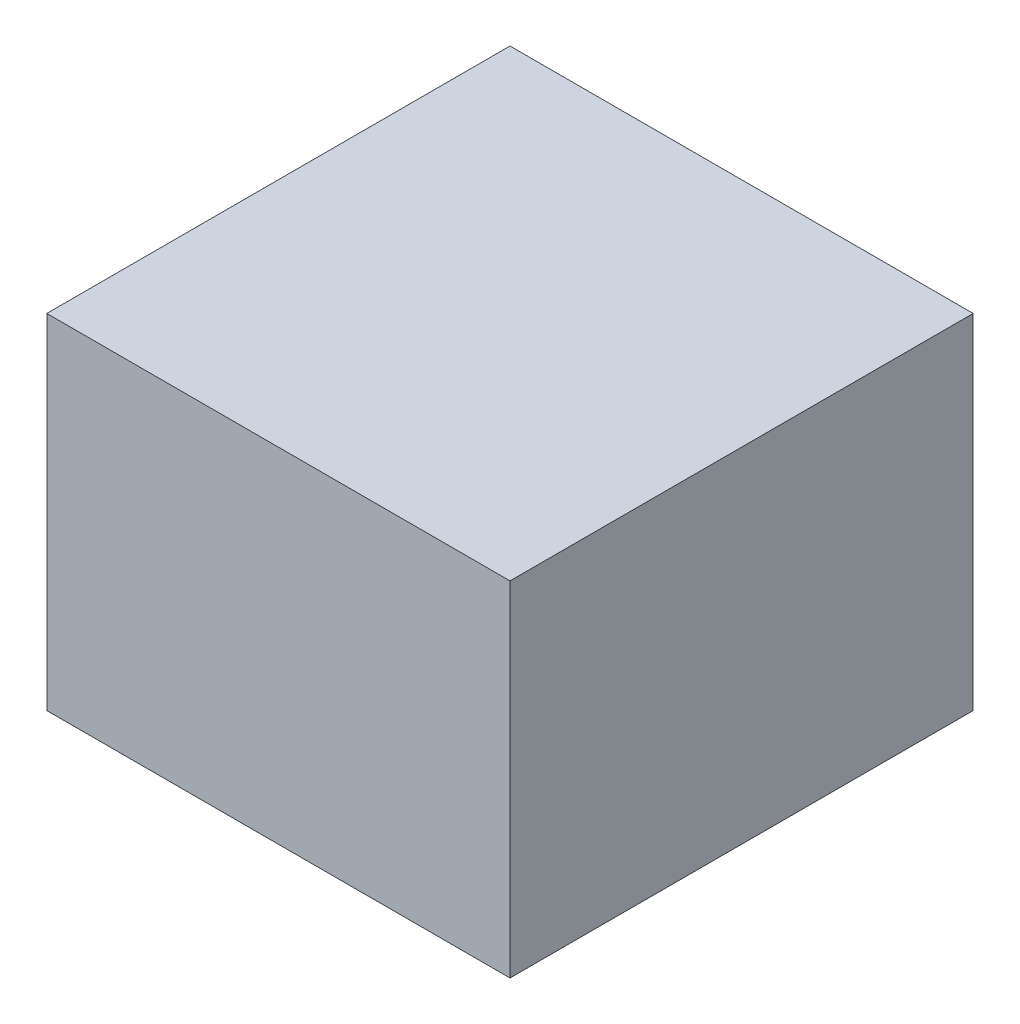
ISO-10303-21;
HEADER;
FILE_DESCRIPTION(('STEP AP214'),'2;1');
FILE_NAME('part.step','',(''),(''),'','','');
FILE_SCHEMA(('AUTOMOTIVE_DESIGN { 1 0 10303 214 1 1 1 1 }'));
ENDSEC;
DATA;
#1=APPLICATION_CONTEXT('core data for automotive mechanical design processes');
#2=APPLICATION_PROTOCOL_DEFINITION('international standard','automotive_design',2000,#1);
#3=PRODUCT_CONTEXT('',#1,'mechanical');
#4=PRODUCT('Part','Part','',(#3));
#5=PRODUCT_RELATED_PRODUCT_CATEGORY('part','',(#4));
#6=PRODUCT_DEFINITION_FORMATION('','',#4);
#7=PRODUCT_DEFINITION_CONTEXT('part definition',#1,'design');
#8=PRODUCT_DEFINITION('design','',#6,#7);
#9=PRODUCT_DEFINITION_SHAPE('','',#8);
#10=(LENGTH_UNIT() NAMED_UNIT(*) SI_UNIT(.MILLI.,.METRE.));
#11=(NAMED_UNIT(*) PLANE_ANGLE_UNIT() SI_UNIT($,.RADIAN.));
#12=(NAMED_UNIT(*) SI_UNIT($,.STERADIAN.) SOLID_ANGLE_UNIT());
#13=UNCERTAINTY_MEASURE_WITH_UNIT(LENGTH_MEASURE(1.E-05),#10,'distance_accuracy_value','');
#14=(GEOMETRIC_REPRESENTATION_CONTEXT(3) GLOBAL_UNCERTAINTY_ASSIGNED_CONTEXT((#13)) GLOBAL_UNIT_ASSIGNED_CONTEXT((#10,
#11,#12)) REPRESENTATION_CONTEXT('',''));
#15=CARTESIAN_POINT('',(0.,0.,0.));
#16=DIRECTION('',(0.,0.,1.));
#17=DIRECTION('',(1.,0.,0.));
#18=AXIS2_PLACEMENT_3D('',#15,#16,#17);
#19=CARTESIAN_POINT('',(-372.682619647355,439.42,-278.021234256927));
#20=DIRECTION('',(1.,0.,0.));
#21=DIRECTION('',(0.,0.,-1.));
#22=AXIS2_PLACEMENT_3D('',#19,#20,#21);
#23=PLANE('',#22);
#24=DIRECTION('',(0.,0.,1.));
#25=VECTOR('',#24,1.);
#26=CARTESIAN_POINT('',(-372.682619647355,0.,-278.021234256927));
#27=LINE('',#26,#25);
#28=CARTESIAN_POINT('',(-372.682619647355,0.,-278.021234256927));
#29=VERTEX_POINT('',#28);
#30=CARTESIAN_POINT('',(-372.682619647355,0.,313.798765743073));
#31=VERTEX_POINT('',#30);
#32=EDGE_CURVE('E96',#29,#31,#27,.T.);
#33=ORIENTED_EDGE('',*,*,#32,.T.);
#34=DIRECTION('',(0.,-1.,0.));
#35=VECTOR('',#34,1.);
#36=CARTESIAN_POINT('',(-372.682619647355,439.42,313.798765743073));
#37=LINE('',#36,#35);
#38=CARTESIAN_POINT('',(-372.682619647355,439.42,313.798765743073));
#39=VERTEX_POINT('',#38);
#40=EDGE_CURVE('E11',#39,#31,#37,.T.);
#41=ORIENTED_EDGE('',*,*,#40,.F.);
#42=DIRECTION('',(0.,0.,1.));
#43=VECTOR('',#42,1.);
#44=CARTESIAN_POINT('',(-372.682619647355,439.42,-278.021234256927));
#45=LINE('',#44,#43);
#46=CARTESIAN_POINT('',(-372.682619647355,439.42,-278.021234256927));
#47=VERTEX_POINT('',#46);
#48=EDGE_CURVE('E84',#47,#39,#45,.T.);
#49=ORIENTED_EDGE('',*,*,#48,.F.);
#50=DIRECTION('',(0.,-1.,0.));
#51=VECTOR('',#50,1.);
#52=CARTESIAN_POINT('',(-372.682619647355,439.42,-278.021234256927));
#53=LINE('',#52,#51);
#54=EDGE_CURVE('E92',#47,#29,#53,.T.);
#55=ORIENTED_EDGE('',*,*,#54,.T.);
#56=EDGE_LOOP('',(#33,#41,#49,#55));
#57=FACE_BOUND('',#56,.T.);
#58=ADVANCED_FACE('F33',(#57),#23,.F.);
#59=CARTESIAN_POINT('',(-372.682619647355,439.42,313.798765743073));
#60=DIRECTION('',(0.,0.,-1.));
#61=DIRECTION('',(-1.,0.,0.));
#62=AXIS2_PLACEMENT_3D('',#59,#60,#61);
#63=PLANE('',#62);
#64=DIRECTION('',(1.,0.,0.));
#65=VECTOR('',#64,1.);
#66=CARTESIAN_POINT('',(-372.682619647355,0.,313.798765743073));
#67=LINE('',#66,#65);
#68=CARTESIAN_POINT('',(219.137380352645,0.,313.798765743073));
#69=VERTEX_POINT('',#68);
#70=EDGE_CURVE('E88',#31,#69,#67,.T.);
#71=ORIENTED_EDGE('',*,*,#70,.T.);
#72=DIRECTION('',(0.,-1.,0.));
#73=VECTOR('',#72,1.);
#74=CARTESIAN_POINT('',(219.137380352645,439.42,313.798765743073));
#75=LINE('',#74,#73);
#76=CARTESIAN_POINT('',(219.137380352645,439.42,313.798765743073));
#77=VERTEX_POINT('',#76);
#78=EDGE_CURVE('E41',#77,#69,#75,.T.);
#79=ORIENTED_EDGE('',*,*,#78,.F.);
#80=DIRECTION('',(1.,0.,0.));
#81=VECTOR('',#80,1.);
#82=CARTESIAN_POINT('',(-372.682619647355,439.42,313.798765743073));
#83=LINE('',#82,#81);
#84=EDGE_CURVE('E79',#39,#77,#83,.T.);
#85=ORIENTED_EDGE('',*,*,#84,.F.);
#86=ORIENTED_EDGE('',*,*,#40,.T.);
#87=EDGE_LOOP('',(#71,#79,#85,#86));
#88=FACE_BOUND('',#87,.T.);
#89=ADVANCED_FACE('F87',(#88),#63,.F.);
#90=CARTESIAN_POINT('',(219.137380352645,439.42,-278.021234256927));
#91=DIRECTION('',(-1.,0.,0.));
#92=DIRECTION('',(0.,0.,1.));
#93=AXIS2_PLACEMENT_3D('',#90,#91,#92);
#94=PLANE('',#93);
#95=DIRECTION('',(0.,0.,-1.));
#96=VECTOR('',#95,1.);
#97=CARTESIAN_POINT('',(219.137380352645,0.,-278.021234256927));
#98=LINE('',#97,#96);
#99=CARTESIAN_POINT('',(219.137380352645,0.,-278.021234256927));
#100=VERTEX_POINT('',#99);
#101=EDGE_CURVE('E66',#69,#100,#98,.T.);
#102=ORIENTED_EDGE('',*,*,#101,.T.);
#103=DIRECTION('',(0.,-1.,0.));
#104=VECTOR('',#103,1.);
#105=CARTESIAN_POINT('',(219.137380352645,439.42,-278.021234256927));
#106=LINE('',#105,#104);
#107=CARTESIAN_POINT('',(219.137380352645,439.42,-278.021234256927));
#108=VERTEX_POINT('',#107);
#109=EDGE_CURVE('E89',#108,#100,#106,.T.);
#110=ORIENTED_EDGE('',*,*,#109,.F.);
#111=DIRECTION('',(0.,0.,-1.));
#112=VECTOR('',#111,1.);
#113=CARTESIAN_POINT('',(219.137380352645,439.42,-278.021234256927));
#114=LINE('',#113,#112);
#115=EDGE_CURVE('E82',#77,#108,#114,.T.);
#116=ORIENTED_EDGE('',*,*,#115,.F.);
#117=ORIENTED_EDGE('',*,*,#78,.T.);
#118=EDGE_LOOP('',(#102,#110,#116,#117));
#119=FACE_BOUND('',#118,.T.);
#120=ADVANCED_FACE('F90',(#119),#94,.F.);
#121=CARTESIAN_POINT('',(-372.682619647355,439.42,-278.021234256927));
#122=DIRECTION('',(0.,0.,1.));
#123=DIRECTION('',(1.,0.,0.));
#124=AXIS2_PLACEMENT_3D('',#121,#122,#123);
#125=PLANE('',#124);
#126=DIRECTION('',(-1.,0.,0.));
#127=VECTOR('',#126,1.);
#128=CARTESIAN_POINT('',(-372.682619647355,0.,-278.021234256927));
#129=LINE('',#128,#127);
#130=EDGE_CURVE('E72',#100,#29,#129,.T.);
#131=ORIENTED_EDGE('',*,*,#130,.T.);
#132=ORIENTED_EDGE('',*,*,#54,.F.);
#133=DIRECTION('',(-1.,0.,0.));
#134=VECTOR('',#133,1.);
#135=CARTESIAN_POINT('',(-372.682619647355,439.42,-278.021234256927));
#136=LINE('',#135,#134);
#137=EDGE_CURVE('E49',#108,#47,#136,.T.);
#138=ORIENTED_EDGE('',*,*,#137,.F.);
#139=ORIENTED_EDGE('',*,*,#109,.T.);
#140=EDGE_LOOP('',(#131,#132,#138,#139));
#141=FACE_BOUND('',#140,.T.);
#142=ADVANCED_FACE('F103',(#141),#125,.F.);
#143=CARTESIAN_POINT('',(0.,439.42,0.));
#144=DIRECTION('',(0.,1.,0.));
#145=DIRECTION('',(0.,0.,1.));
#146=AXIS2_PLACEMENT_3D('',#143,#144,#145);
#147=PLANE('',#146);
#148=ORIENTED_EDGE('',*,*,#48,.T.);
#149=ORIENTED_EDGE('',*,*,#84,.T.);
#150=ORIENTED_EDGE('',*,*,#115,.T.);
#151=ORIENTED_EDGE('',*,*,#137,.T.);
#152=EDGE_LOOP('',(#148,#149,#150,#151));
#153=FACE_BOUND('',#152,.T.);
#154=ADVANCED_FACE('F80',(#153),#147,.T.);
#155=CARTESIAN_POINT('',(0.,0.,0.));
#156=DIRECTION('',(0.,1.,0.));
#157=DIRECTION('',(0.,0.,1.));
#158=AXIS2_PLACEMENT_3D('',#155,#156,#157);
#159=PLANE('',#158);
#160=ORIENTED_EDGE('',*,*,#32,.F.);
#161=ORIENTED_EDGE('',*,*,#130,.F.);
#162=ORIENTED_EDGE('',*,*,#101,.F.);
#163=ORIENTED_EDGE('',*,*,#70,.F.);
#164=EDGE_LOOP('',(#160,#161,#162,#163));
#165=FACE_BOUND('',#164,.T.);
#166=ADVANCED_FACE('F106',(#165),#159,.F.);
#167=CLOSED_SHELL('',(#58,#89,#120,#142,#154,#166));
#168=MANIFOLD_SOLID_BREP('B2',#167);
#169=ADVANCED_BREP_SHAPE_REPRESENTATION('',(#18,#168),#14);
#170=SHAPE_DEFINITION_REPRESENTATION(#9,#169);
ENDSEC;
END-ISO-10303-21;
